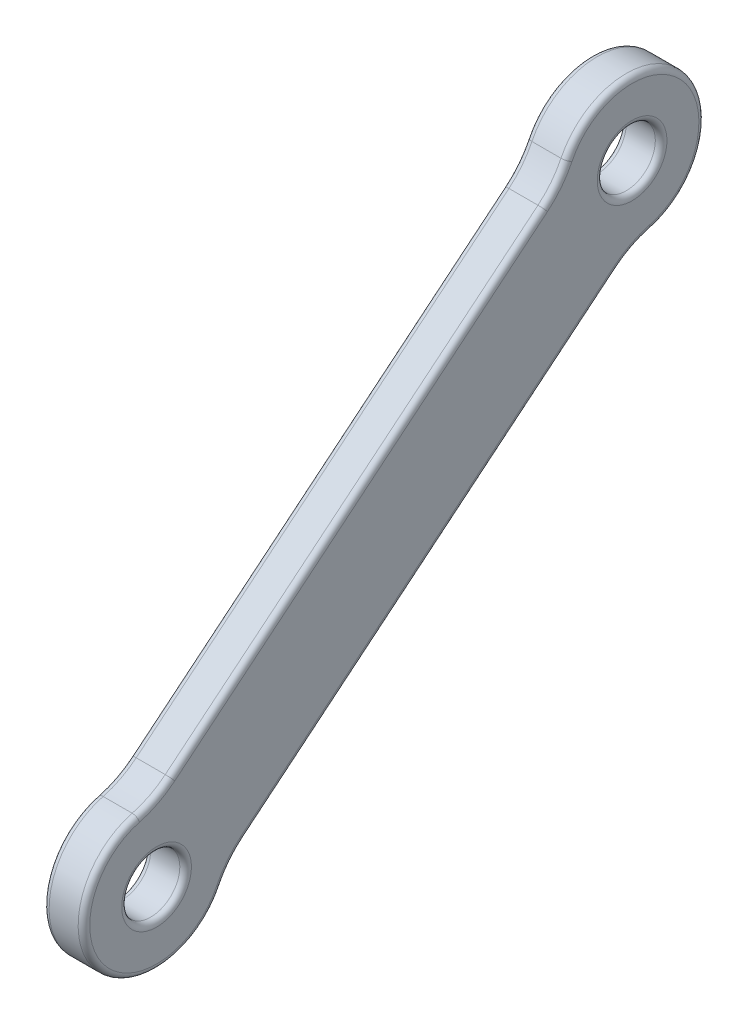
ISO-10303-21;
HEADER;
FILE_DESCRIPTION(('STEP AP214'),'2;1');
FILE_NAME('part.step','',(''),(''),'','','');
FILE_SCHEMA(('AUTOMOTIVE_DESIGN { 1 0 10303 214 1 1 1 1 }'));
ENDSEC;
DATA;
#1=APPLICATION_CONTEXT('core data for automotive mechanical design processes');
#2=APPLICATION_PROTOCOL_DEFINITION('international standard','automotive_design',2000,#1);
#3=PRODUCT_CONTEXT('',#1,'mechanical');
#4=PRODUCT('Part','Part','',(#3));
#5=PRODUCT_RELATED_PRODUCT_CATEGORY('part','',(#4));
#6=PRODUCT_DEFINITION_FORMATION('','',#4);
#7=PRODUCT_DEFINITION_CONTEXT('part definition',#1,'design');
#8=PRODUCT_DEFINITION('design','',#6,#7);
#9=PRODUCT_DEFINITION_SHAPE('','',#8);
#10=(LENGTH_UNIT() NAMED_UNIT(*) SI_UNIT(.MILLI.,.METRE.));
#11=(NAMED_UNIT(*) PLANE_ANGLE_UNIT() SI_UNIT($,.RADIAN.));
#12=(NAMED_UNIT(*) SI_UNIT($,.STERADIAN.) SOLID_ANGLE_UNIT());
#13=UNCERTAINTY_MEASURE_WITH_UNIT(LENGTH_MEASURE(1.E-05),#10,'distance_accuracy_value','');
#14=(GEOMETRIC_REPRESENTATION_CONTEXT(3) GLOBAL_UNCERTAINTY_ASSIGNED_CONTEXT((#13)) GLOBAL_UNIT_ASSIGNED_CONTEXT((#10,
#11,#12)) REPRESENTATION_CONTEXT('',''));
#15=CARTESIAN_POINT('',(0.,0.,0.));
#16=DIRECTION('',(0.,0.,1.));
#17=DIRECTION('',(1.,0.,0.));
#18=AXIS2_PLACEMENT_3D('',#15,#16,#17);
#19=CARTESIAN_POINT('',(7.,79.37572597113,-57.1224912642021));
#20=DIRECTION('',(1.,0.,0.));
#21=DIRECTION('',(0.,0.,-1.));
#22=AXIS2_PLACEMENT_3D('',#19,#20,#21);
#23=PLANE('',#22);
#24=CARTESIAN_POINT('',(7.,67.3497753058128,-81.853575158673));
#25=DIRECTION('',(1.,0.,0.));
#26=DIRECTION('',(0.,0.,-1.));
#27=AXIS2_PLACEMENT_3D('',#24,#25,#26);
#28=CIRCLE('',#27,5.99999999999845);
#29=CARTESIAN_POINT('',(7.,67.3497753058128,-87.8535751586714));
#30=VERTEX_POINT('',#29);
#31=EDGE_CURVE('E11',#30,#30,#28,.F.);
#32=ORIENTED_EDGE('',*,*,#31,.T.);
#33=EDGE_LOOP('',(#32));
#34=FACE_BOUND('',#33,.T.);
#35=CARTESIAN_POINT('',(7.,40.765549009494,-88.8912532009045));
#36=DIRECTION('',(1.,0.,0.));
#37=DIRECTION('',(0.,0.,-1.));
#38=AXIS2_PLACEMENT_3D('',#35,#36,#37);
#39=CIRCLE('',#38,16.);
#40=CARTESIAN_POINT('',(7.,53.120805637218,-78.725249381159));
#41=VERTEX_POINT('',#40);
#42=CARTESIAN_POINT('',(7.,56.2327352182613,-84.7966041581516));
#43=VERTEX_POINT('',#42);
#44=EDGE_CURVE('E58',#41,#43,#39,.F.);
#45=ORIENTED_EDGE('',*,*,#44,.T.);
#46=CARTESIAN_POINT('',(7.,67.3497753058128,-81.853575158673));
#47=DIRECTION('',(1.,0.,0.));
#48=DIRECTION('',(0.,0.,-1.));
#49=AXIS2_PLACEMENT_3D('',#46,#47,#48);
#50=CIRCLE('',#49,11.5);
#51=CARTESIAN_POINT('',(7.,72.3788092204,-71.5114855300761));
#52=VERTEX_POINT('',#51);
#53=EDGE_CURVE('E50',#43,#52,#50,.T.);
#54=ORIENTED_EDGE('',*,*,#53,.T.);
#55=CARTESIAN_POINT('',(7.,79.37572597113,-57.1224912642021));
#56=DIRECTION('',(1.,0.,0.));
#57=DIRECTION('',(0.,0.,-1.));
#58=AXIS2_PLACEMENT_3D('',#55,#56,#57);
#59=CIRCLE('',#58,16.);
#60=CARTESIAN_POINT('',(7.,67.0204693434057,-67.2884950839473));
#61=VERTEX_POINT('',#60);
#62=EDGE_CURVE('E241',#52,#61,#59,.F.);
#63=ORIENTED_EDGE('',*,*,#62,.T.);
#64=DIRECTION('',(0.,-0.635375238734072,0.772203539232773));
#65=VECTOR('',#64,1.);
#66=CARTESIAN_POINT('',(7.,14.2289696685938,-3.12832577751079));
#67=LINE('',#66,#65);
#68=CARTESIAN_POINT('',(7.,14.2289696685938,-3.12832577751081));
#69=VERTEX_POINT('',#68);
#70=EDGE_CURVE('E243',#61,#69,#67,.T.);
#71=ORIENTED_EDGE('',*,*,#70,.T.);
#72=CARTESIAN_POINT('',(7.,26.584226296318,7.03767804223475));
#73=DIRECTION('',(1.,0.,0.));
#74=DIRECTION('',(0.,0.,-1.));
#75=AXIS2_PLACEMENT_3D('',#72,#73,#74);
#76=CIRCLE('',#75,16.0000000000001);
#77=CARTESIAN_POINT('',(7.,11.1170400875511,2.9430289994798));
#78=VERTEX_POINT('',#77);
#79=EDGE_CURVE('E245',#69,#78,#76,.F.);
#80=ORIENTED_EDGE('',*,*,#79,.T.);
#81=CARTESIAN_POINT('',(7.,0.,0.));
#82=DIRECTION('',(1.,0.,0.));
#83=DIRECTION('',(0.,0.,-1.));
#84=AXIS2_PLACEMENT_3D('',#81,#82,#83);
#85=CIRCLE('',#84,11.5);
#86=CARTESIAN_POINT('',(7.,-5.02903391458844,-10.3420896285963));
#87=VERTEX_POINT('',#86);
#88=EDGE_CURVE('E247',#78,#87,#85,.T.);
#89=ORIENTED_EDGE('',*,*,#88,.T.);
#90=CARTESIAN_POINT('',(7.,-12.0259506653202,-24.7310838944694));
#91=DIRECTION('',(1.,0.,0.));
#92=DIRECTION('',(0.,0.,-1.));
#93=AXIS2_PLACEMENT_3D('',#90,#91,#92);
#94=CIRCLE('',#93,16.);
#95=CARTESIAN_POINT('',(7.,0.329305962404,-14.5650800747241));
#96=VERTEX_POINT('',#95);
#97=EDGE_CURVE('E249',#87,#96,#94,.F.);
#98=ORIENTED_EDGE('',*,*,#97,.T.);
#99=DIRECTION('',(0.,0.635375238734096,-0.772203539232753));
#100=VECTOR('',#99,1.);
#101=CARTESIAN_POINT('',(7.,53.120805637218,-78.725249381159));
#102=LINE('',#101,#100);
#103=EDGE_CURVE('E63',#96,#41,#102,.T.);
#104=ORIENTED_EDGE('',*,*,#103,.T.);
#105=EDGE_LOOP('',(#45,#54,#63,#71,#80,#89,#98,#104));
#106=FACE_BOUND('',#105,.T.);
#107=CARTESIAN_POINT('',(7.,0.,0.));
#108=DIRECTION('',(1.,0.,0.));
#109=DIRECTION('',(0.,0.,-1.));
#110=AXIS2_PLACEMENT_3D('',#107,#108,#109);
#111=CIRCLE('',#110,6.);
#112=CARTESIAN_POINT('',(7.,0.,-6.));
#113=VERTEX_POINT('',#112);
#114=EDGE_CURVE('E238',#113,#113,#111,.F.);
#115=ORIENTED_EDGE('',*,*,#114,.T.);
#116=EDGE_LOOP('',(#115));
#117=FACE_BOUND('',#116,.T.);
#118=ADVANCED_FACE('F41',(#34,#106,#117),#23,.T.);
#119=CARTESIAN_POINT('',(0.,79.37572597113,-57.1224912642021));
#120=DIRECTION('',(1.,0.,0.));
#121=DIRECTION('',(0.,0.,-1.));
#122=AXIS2_PLACEMENT_3D('',#119,#120,#121);
#123=PLANE('',#122);
#124=CARTESIAN_POINT('',(0.,67.3497753058128,-81.853575158673));
#125=DIRECTION('',(1.,0.,0.));
#126=DIRECTION('',(0.,0.,-1.));
#127=AXIS2_PLACEMENT_3D('',#124,#125,#126);
#128=CIRCLE('',#127,5.99999999999845);
#129=CARTESIAN_POINT('',(0.,67.3497753058128,-87.8535751586714));
#130=VERTEX_POINT('',#129);
#131=EDGE_CURVE('E186',#130,#130,#128,.T.);
#132=ORIENTED_EDGE('',*,*,#131,.T.);
#133=EDGE_LOOP('',(#132));
#134=FACE_BOUND('',#133,.T.);
#135=CARTESIAN_POINT('',(0.,0.,0.));
#136=DIRECTION('',(1.,0.,0.));
#137=DIRECTION('',(0.,0.,-1.));
#138=AXIS2_PLACEMENT_3D('',#135,#136,#137);
#139=CIRCLE('',#138,6.);
#140=CARTESIAN_POINT('',(0.,0.,-6.));
#141=VERTEX_POINT('',#140);
#142=EDGE_CURVE('E183',#141,#141,#139,.T.);
#143=ORIENTED_EDGE('',*,*,#142,.T.);
#144=EDGE_LOOP('',(#143));
#145=FACE_BOUND('',#144,.T.);
#146=CARTESIAN_POINT('',(0.,26.584226296318,7.03767804223475));
#147=DIRECTION('',(1.,0.,0.));
#148=DIRECTION('',(0.,0.,-1.));
#149=AXIS2_PLACEMENT_3D('',#146,#147,#148);
#150=CIRCLE('',#149,16.0000000000001);
#151=CARTESIAN_POINT('',(0.,11.1170400875512,2.94302899947979));
#152=VERTEX_POINT('',#151);
#153=CARTESIAN_POINT('',(0.,14.2289696685938,-3.12832577751074));
#154=VERTEX_POINT('',#153);
#155=EDGE_CURVE('E182',#152,#154,#150,.T.);
#156=ORIENTED_EDGE('',*,*,#155,.T.);
#157=DIRECTION('',(0.,-0.635375238734072,0.772203539232773));
#158=VECTOR('',#157,1.);
#159=CARTESIAN_POINT('',(0.,67.0204693434057,-67.2884950839473));
#160=LINE('',#159,#158);
#161=CARTESIAN_POINT('',(0.,67.0204693434057,-67.2884950839473));
#162=VERTEX_POINT('',#161);
#163=EDGE_CURVE('E161',#154,#162,#160,.F.);
#164=ORIENTED_EDGE('',*,*,#163,.T.);
#165=CARTESIAN_POINT('',(0.,79.37572597113,-57.1224912642021));
#166=DIRECTION('',(1.,0.,0.));
#167=DIRECTION('',(0.,0.,-1.));
#168=AXIS2_PLACEMENT_3D('',#165,#166,#167);
#169=CIRCLE('',#168,16.);
#170=CARTESIAN_POINT('',(0.,72.3788092204,-71.5114855300761));
#171=VERTEX_POINT('',#170);
#172=EDGE_CURVE('E171',#162,#171,#169,.T.);
#173=ORIENTED_EDGE('',*,*,#172,.T.);
#174=CARTESIAN_POINT('',(0.,67.3497753058128,-81.853575158673));
#175=DIRECTION('',(1.,0.,0.));
#176=DIRECTION('',(0.,0.,-1.));
#177=AXIS2_PLACEMENT_3D('',#174,#175,#176);
#178=CIRCLE('',#177,11.5);
#179=CARTESIAN_POINT('',(0.,56.2327352182613,-84.7966041581516));
#180=VERTEX_POINT('',#179);
#181=EDGE_CURVE('E177',#171,#180,#178,.F.);
#182=ORIENTED_EDGE('',*,*,#181,.T.);
#183=CARTESIAN_POINT('',(0.,40.765549009494,-88.8912532009045));
#184=DIRECTION('',(1.,0.,0.));
#185=DIRECTION('',(0.,0.,-1.));
#186=AXIS2_PLACEMENT_3D('',#183,#184,#185);
#187=CIRCLE('',#186,16.);
#188=CARTESIAN_POINT('',(0.,53.120805637218,-78.725249381159));
#189=VERTEX_POINT('',#188);
#190=EDGE_CURVE('E327',#180,#189,#187,.T.);
#191=ORIENTED_EDGE('',*,*,#190,.T.);
#192=DIRECTION('',(0.,0.635375238734096,-0.772203539232753));
#193=VECTOR('',#192,1.);
#194=CARTESIAN_POINT('',(0.,53.1208056372185,-78.7252493811597));
#195=LINE('',#194,#193);
#196=CARTESIAN_POINT('',(0.,0.329305962403997,-14.5650800747241));
#197=VERTEX_POINT('',#196);
#198=EDGE_CURVE('E329',#189,#197,#195,.F.);
#199=ORIENTED_EDGE('',*,*,#198,.T.);
#200=CARTESIAN_POINT('',(0.,-12.0259506653202,-24.7310838944694));
#201=DIRECTION('',(1.,0.,0.));
#202=DIRECTION('',(0.,0.,-1.));
#203=AXIS2_PLACEMENT_3D('',#200,#201,#202);
#204=CIRCLE('',#203,16.);
#205=CARTESIAN_POINT('',(0.,-5.02903391458845,-10.3420896285963));
#206=VERTEX_POINT('',#205);
#207=EDGE_CURVE('E331',#197,#206,#204,.T.);
#208=ORIENTED_EDGE('',*,*,#207,.T.);
#209=CARTESIAN_POINT('',(0.,0.,0.));
#210=DIRECTION('',(1.,0.,0.));
#211=DIRECTION('',(0.,0.,-1.));
#212=AXIS2_PLACEMENT_3D('',#209,#210,#211);
#213=CIRCLE('',#212,11.5);
#214=EDGE_CURVE('E188',#206,#152,#213,.F.);
#215=ORIENTED_EDGE('',*,*,#214,.T.);
#216=EDGE_LOOP('',(#156,#164,#173,#182,#191,#199,#208,#215));
#217=FACE_BOUND('',#216,.T.);
#218=ADVANCED_FACE('F180',(#134,#145,#217),#123,.F.);
#219=CARTESIAN_POINT('',(7.,79.37572597113,-57.1224912642021));
#220=DIRECTION('',(-1.,0.,0.));
#221=DIRECTION('',(0.,0.,1.));
#222=AXIS2_PLACEMENT_3D('',#219,#220,#221);
#223=CYLINDRICAL_SURFACE('',#222,15.);
#224=DIRECTION('',(-1.,0.,0.));
#225=VECTOR('',#224,1.);
#226=CARTESIAN_POINT('',(7.,72.8161165173207,-70.612173388459));
#227=LINE('',#226,#225);
#228=CARTESIAN_POINT('',(6.,72.8161165173207,-70.612173388459));
#229=VERTEX_POINT('',#228);
#230=CARTESIAN_POINT('',(1.,72.8161165173207,-70.612173388459));
#231=VERTEX_POINT('',#230);
#232=EDGE_CURVE('E270',#229,#231,#227,.T.);
#233=ORIENTED_EDGE('',*,*,#232,.T.);
#234=CARTESIAN_POINT('',(1.,79.37572597113,-57.1224912642021));
#235=DIRECTION('',(1.,0.,0.));
#236=DIRECTION('',(0.,0.,-1.));
#237=AXIS2_PLACEMENT_3D('',#234,#235,#236);
#238=CIRCLE('',#237,15.);
#239=CARTESIAN_POINT('',(1.,67.7926728826384,-66.6531198452132));
#240=VERTEX_POINT('',#239);
#241=EDGE_CURVE('E236',#231,#240,#238,.F.);
#242=ORIENTED_EDGE('',*,*,#241,.T.);
#243=DIRECTION('',(-1.,0.,0.));
#244=VECTOR('',#243,1.);
#245=CARTESIAN_POINT('',(7.,67.7926728826384,-66.6531198452132));
#246=LINE('',#245,#244);
#247=CARTESIAN_POINT('',(6.,67.7926728826384,-66.6531198452132));
#248=VERTEX_POINT('',#247);
#249=EDGE_CURVE('E178',#248,#240,#246,.T.);
#250=ORIENTED_EDGE('',*,*,#249,.F.);
#251=CARTESIAN_POINT('',(6.,79.37572597113,-57.1224912642021));
#252=DIRECTION('',(1.,0.,0.));
#253=DIRECTION('',(0.,0.,-1.));
#254=AXIS2_PLACEMENT_3D('',#251,#252,#253);
#255=CIRCLE('',#254,15.);
#256=EDGE_CURVE('E234',#248,#229,#255,.T.);
#257=ORIENTED_EDGE('',*,*,#256,.T.);
#258=EDGE_LOOP('',(#233,#242,#250,#257));
#259=FACE_BOUND('',#258,.T.);
#260=ADVANCED_FACE('F348',(#259),#223,.F.);
#261=CARTESIAN_POINT('',(7.,67.7926728826384,-66.6531198452132));
#262=DIRECTION('',(0.,-0.772203539232773,-0.635375238734072));
#263=DIRECTION('',(0.,0.635375238734072,-0.772203539232773));
#264=AXIS2_PLACEMENT_3D('',#261,#262,#263);
#265=PLANE('',#264);
#266=ORIENTED_EDGE('',*,*,#249,.T.);
#267=DIRECTION('',(0.,-0.635375238734072,0.772203539232773));
#268=VECTOR('',#267,1.);
#269=CARTESIAN_POINT('',(1.,67.7926728826384,-66.6531198452132));
#270=LINE('',#269,#268);
#271=CARTESIAN_POINT('',(1.,15.0011732078266,-2.49295053877667));
#272=VERTEX_POINT('',#271);
#273=EDGE_CURVE('E164',#240,#272,#270,.T.);
#274=ORIENTED_EDGE('',*,*,#273,.T.);
#275=DIRECTION('',(-1.,0.,0.));
#276=VECTOR('',#275,1.);
#277=CARTESIAN_POINT('',(7.,15.0011732078266,-2.49295053877667));
#278=LINE('',#277,#276);
#279=CARTESIAN_POINT('',(6.,15.0011732078266,-2.49295053877667));
#280=VERTEX_POINT('',#279);
#281=EDGE_CURVE('E317',#280,#272,#278,.T.);
#282=ORIENTED_EDGE('',*,*,#281,.F.);
#283=DIRECTION('',(0.,-0.635375238734072,0.772203539232773));
#284=VECTOR('',#283,1.);
#285=CARTESIAN_POINT('',(6.,67.7926728826384,-66.6531198452132));
#286=LINE('',#285,#284);
#287=EDGE_CURVE('E206',#280,#248,#286,.F.);
#288=ORIENTED_EDGE('',*,*,#287,.T.);
#289=EDGE_LOOP('',(#266,#274,#282,#288));
#290=FACE_BOUND('',#289,.T.);
#291=ADVANCED_FACE('F341',(#290),#265,.F.);
#292=CARTESIAN_POINT('',(7.,26.584226296318,7.03767804223475));
#293=DIRECTION('',(-1.,0.,0.));
#294=DIRECTION('',(0.,0.,1.));
#295=AXIS2_PLACEMENT_3D('',#292,#293,#294);
#296=CYLINDRICAL_SURFACE('',#295,15.0000000000001);
#297=ORIENTED_EDGE('',*,*,#281,.T.);
#298=CARTESIAN_POINT('',(1.,26.584226296318,7.03767804223475));
#299=DIRECTION('',(1.,0.,0.));
#300=DIRECTION('',(0.,0.,-1.));
#301=AXIS2_PLACEMENT_3D('',#298,#299,#300);
#302=CIRCLE('',#301,15.0000000000001);
#303=CARTESIAN_POINT('',(1.,12.0837392255991,3.19894456465198));
#304=VERTEX_POINT('',#303);
#305=EDGE_CURVE('E211',#272,#304,#302,.F.);
#306=ORIENTED_EDGE('',*,*,#305,.T.);
#307=DIRECTION('',(-1.,0.,0.));
#308=VECTOR('',#307,1.);
#309=CARTESIAN_POINT('',(7.,12.0837392255991,3.19894456465198));
#310=LINE('',#309,#308);
#311=CARTESIAN_POINT('',(6.,12.0837392255991,3.19894456465198));
#312=VERTEX_POINT('',#311);
#313=EDGE_CURVE('E308',#312,#304,#310,.T.);
#314=ORIENTED_EDGE('',*,*,#313,.F.);
#315=CARTESIAN_POINT('',(6.,26.584226296318,7.03767804223475));
#316=DIRECTION('',(1.,0.,0.));
#317=DIRECTION('',(0.,0.,-1.));
#318=AXIS2_PLACEMENT_3D('',#315,#316,#317);
#319=CIRCLE('',#318,15.0000000000001);
#320=EDGE_CURVE('E209',#312,#280,#319,.T.);
#321=ORIENTED_EDGE('',*,*,#320,.T.);
#322=EDGE_LOOP('',(#297,#306,#314,#321));
#323=FACE_BOUND('',#322,.T.);
#324=ADVANCED_FACE('F314',(#323),#296,.F.);
#325=CARTESIAN_POINT('',(7.,0.,0.));
#326=DIRECTION('',(-1.,0.,0.));
#327=DIRECTION('',(0.,0.,1.));
#328=AXIS2_PLACEMENT_3D('',#325,#326,#327);
#329=CYLINDRICAL_SURFACE('',#328,12.5);
#330=ORIENTED_EDGE('',*,*,#313,.T.);
#331=CARTESIAN_POINT('',(1.,0.,0.));
#332=DIRECTION('',(1.,0.,0.));
#333=DIRECTION('',(0.,0.,-1.));
#334=AXIS2_PLACEMENT_3D('',#331,#332,#333);
#335=CIRCLE('',#334,12.5);
#336=CARTESIAN_POINT('',(1.,-5.46634121150919,-11.2414017702134));
#337=VERTEX_POINT('',#336);
#338=EDGE_CURVE('E215',#304,#337,#335,.T.);
#339=ORIENTED_EDGE('',*,*,#338,.T.);
#340=DIRECTION('',(-1.,0.,0.));
#341=VECTOR('',#340,1.);
#342=CARTESIAN_POINT('',(7.,-5.46634121150919,-11.2414017702134));
#343=LINE('',#342,#341);
#344=CARTESIAN_POINT('',(6.,-5.46634121150919,-11.2414017702134));
#345=VERTEX_POINT('',#344);
#346=EDGE_CURVE('E311',#345,#337,#343,.T.);
#347=ORIENTED_EDGE('',*,*,#346,.F.);
#348=CARTESIAN_POINT('',(6.,0.,0.));
#349=DIRECTION('',(1.,0.,0.));
#350=DIRECTION('',(0.,0.,-1.));
#351=AXIS2_PLACEMENT_3D('',#348,#349,#350);
#352=CIRCLE('',#351,12.5);
#353=EDGE_CURVE('E213',#345,#312,#352,.F.);
#354=ORIENTED_EDGE('',*,*,#353,.T.);
#355=EDGE_LOOP('',(#330,#339,#347,#354));
#356=FACE_BOUND('',#355,.T.);
#357=ADVANCED_FACE('F307',(#356),#329,.T.);
#358=CARTESIAN_POINT('',(7.,-12.0259506653202,-24.7310838944694));
#359=DIRECTION('',(-1.,0.,0.));
#360=DIRECTION('',(0.,0.,1.));
#361=AXIS2_PLACEMENT_3D('',#358,#359,#360);
#362=CYLINDRICAL_SURFACE('',#361,15.);
#363=ORIENTED_EDGE('',*,*,#346,.T.);
#364=CARTESIAN_POINT('',(1.,-12.0259506653202,-24.7310838944694));
#365=DIRECTION('',(1.,0.,0.));
#366=DIRECTION('',(0.,0.,-1.));
#367=AXIS2_PLACEMENT_3D('',#364,#365,#366);
#368=CIRCLE('',#367,15.);
#369=CARTESIAN_POINT('',(1.,-0.442897576828766,-15.2004553134582));
#370=VERTEX_POINT('',#369);
#371=EDGE_CURVE('E219',#337,#370,#368,.F.);
#372=ORIENTED_EDGE('',*,*,#371,.T.);
#373=DIRECTION('',(-1.,0.,0.));
#374=VECTOR('',#373,1.);
#375=CARTESIAN_POINT('',(7.,-0.442897576828766,-15.2004553134582));
#376=LINE('',#375,#374);
#377=CARTESIAN_POINT('',(6.,-0.442897576828766,-15.2004553134582));
#378=VERTEX_POINT('',#377);
#379=EDGE_CURVE('E320',#378,#370,#376,.T.);
#380=ORIENTED_EDGE('',*,*,#379,.F.);
#381=CARTESIAN_POINT('',(6.,-12.0259506653202,-24.7310838944694));
#382=DIRECTION('',(1.,0.,0.));
#383=DIRECTION('',(0.,0.,-1.));
#384=AXIS2_PLACEMENT_3D('',#381,#382,#383);
#385=CIRCLE('',#384,15.);
#386=EDGE_CURVE('E217',#378,#345,#385,.T.);
#387=ORIENTED_EDGE('',*,*,#386,.T.);
#388=EDGE_LOOP('',(#363,#372,#380,#387));
#389=FACE_BOUND('',#388,.T.);
#390=ADVANCED_FACE('F393',(#389),#362,.F.);
#391=CARTESIAN_POINT('',(7.,-0.442897576828766,-15.2004553134582));
#392=DIRECTION('',(0.,0.772203539232753,0.635375238734096));
#393=DIRECTION('',(0.,-0.635375238734096,0.772203539232753));
#394=AXIS2_PLACEMENT_3D('',#391,#392,#393);
#395=PLANE('',#394);
#396=ORIENTED_EDGE('',*,*,#379,.T.);
#397=DIRECTION('',(0.,0.635375238734096,-0.772203539232753));
#398=VECTOR('',#397,1.);
#399=CARTESIAN_POINT('',(1.,-0.442897576828766,-15.2004553134582));
#400=LINE('',#399,#398);
#401=CARTESIAN_POINT('',(1.,52.3486020979853,-79.3606246198931));
#402=VERTEX_POINT('',#401);
#403=EDGE_CURVE('E223',#370,#402,#400,.T.);
#404=ORIENTED_EDGE('',*,*,#403,.T.);
#405=DIRECTION('',(-1.,0.,0.));
#406=VECTOR('',#405,1.);
#407=CARTESIAN_POINT('',(7.,52.3486020979853,-79.3606246198931));
#408=LINE('',#407,#406);
#409=CARTESIAN_POINT('',(6.,52.3486020979853,-79.3606246198931));
#410=VERTEX_POINT('',#409);
#411=EDGE_CURVE('E374',#410,#402,#408,.T.);
#412=ORIENTED_EDGE('',*,*,#411,.F.);
#413=DIRECTION('',(0.,0.635375238734096,-0.772203539232753));
#414=VECTOR('',#413,1.);
#415=CARTESIAN_POINT('',(6.,-0.442897576828782,-15.2004553134582));
#416=LINE('',#415,#414);
#417=EDGE_CURVE('E221',#410,#378,#416,.F.);
#418=ORIENTED_EDGE('',*,*,#417,.T.);
#419=EDGE_LOOP('',(#396,#404,#412,#418));
#420=FACE_BOUND('',#419,.T.);
#421=ADVANCED_FACE('F382',(#420),#395,.F.);
#422=CARTESIAN_POINT('',(7.,40.765549009494,-88.8912532009045));
#423=DIRECTION('',(-1.,0.,0.));
#424=DIRECTION('',(0.,0.,1.));
#425=AXIS2_PLACEMENT_3D('',#422,#423,#424);
#426=CYLINDRICAL_SURFACE('',#425,15.);
#427=ORIENTED_EDGE('',*,*,#411,.T.);
#428=CARTESIAN_POINT('',(1.,40.765549009494,-88.8912532009045));
#429=DIRECTION('',(1.,0.,0.));
#430=DIRECTION('',(0.,0.,-1.));
#431=AXIS2_PLACEMENT_3D('',#428,#429,#430);
#432=CIRCLE('',#431,15.);
#433=CARTESIAN_POINT('',(1.,55.2660360802133,-85.0525197233237));
#434=VERTEX_POINT('',#433);
#435=EDGE_CURVE('E227',#402,#434,#432,.F.);
#436=ORIENTED_EDGE('',*,*,#435,.T.);
#437=DIRECTION('',(-1.,0.,0.));
#438=VECTOR('',#437,1.);
#439=CARTESIAN_POINT('',(7.,55.2660360802133,-85.0525197233237));
#440=LINE('',#439,#438);
#441=CARTESIAN_POINT('',(6.,55.2660360802133,-85.0525197233237));
#442=VERTEX_POINT('',#441);
#443=EDGE_CURVE('E367',#442,#434,#440,.T.);
#444=ORIENTED_EDGE('',*,*,#443,.F.);
#445=CARTESIAN_POINT('',(6.,40.765549009494,-88.8912532009045));
#446=DIRECTION('',(1.,0.,0.));
#447=DIRECTION('',(0.,0.,-1.));
#448=AXIS2_PLACEMENT_3D('',#445,#446,#447);
#449=CIRCLE('',#448,15.);
#450=EDGE_CURVE('E225',#442,#410,#449,.T.);
#451=ORIENTED_EDGE('',*,*,#450,.T.);
#452=EDGE_LOOP('',(#427,#436,#444,#451));
#453=FACE_BOUND('',#452,.T.);
#454=ADVANCED_FACE('F371',(#453),#426,.F.);
#455=CARTESIAN_POINT('',(7.,67.3497753058128,-81.853575158673));
#456=DIRECTION('',(-1.,0.,0.));
#457=DIRECTION('',(0.,0.,1.));
#458=AXIS2_PLACEMENT_3D('',#455,#456,#457);
#459=CYLINDRICAL_SURFACE('',#458,12.5);
#460=ORIENTED_EDGE('',*,*,#443,.T.);
#461=CARTESIAN_POINT('',(1.,67.3497753058128,-81.853575158673));
#462=DIRECTION('',(1.,0.,0.));
#463=DIRECTION('',(0.,0.,-1.));
#464=AXIS2_PLACEMENT_3D('',#461,#462,#463);
#465=CIRCLE('',#464,12.5);
#466=EDGE_CURVE('E232',#434,#231,#465,.T.);
#467=ORIENTED_EDGE('',*,*,#466,.T.);
#468=ORIENTED_EDGE('',*,*,#232,.F.);
#469=CARTESIAN_POINT('',(6.,67.3497753058128,-81.853575158673));
#470=DIRECTION('',(1.,0.,0.));
#471=DIRECTION('',(0.,0.,-1.));
#472=AXIS2_PLACEMENT_3D('',#469,#470,#471);
#473=CIRCLE('',#472,12.5);
#474=EDGE_CURVE('E229',#229,#442,#473,.F.);
#475=ORIENTED_EDGE('',*,*,#474,.T.);
#476=EDGE_LOOP('',(#460,#467,#468,#475));
#477=FACE_BOUND('',#476,.T.);
#478=ADVANCED_FACE('F366',(#477),#459,.T.);
#479=CARTESIAN_POINT('',(7.,0.,0.));
#480=DIRECTION('',(-1.,0.,0.));
#481=DIRECTION('',(0.,0.,1.));
#482=AXIS2_PLACEMENT_3D('',#479,#480,#481);
#483=CYLINDRICAL_SURFACE('',#482,5.);
#484=CARTESIAN_POINT('',(1.,0.,0.));
#485=DIRECTION('',(1.,0.,0.));
#486=DIRECTION('',(0.,0.,-1.));
#487=AXIS2_PLACEMENT_3D('',#484,#485,#486);
#488=CIRCLE('',#487,5.);
#489=CARTESIAN_POINT('',(1.,0.,-5.));
#490=VERTEX_POINT('',#489);
#491=EDGE_CURVE('E203',#490,#490,#488,.F.);
#492=ORIENTED_EDGE('',*,*,#491,.T.);
#493=EDGE_LOOP('',(#492));
#494=FACE_BOUND('',#493,.T.);
#495=CARTESIAN_POINT('',(6.,0.,0.));
#496=DIRECTION('',(1.,0.,0.));
#497=DIRECTION('',(0.,0.,-1.));
#498=AXIS2_PLACEMENT_3D('',#495,#496,#497);
#499=CIRCLE('',#498,5.);
#500=CARTESIAN_POINT('',(6.,0.,-5.));
#501=VERTEX_POINT('',#500);
#502=EDGE_CURVE('E200',#501,#501,#499,.T.);
#503=ORIENTED_EDGE('',*,*,#502,.T.);
#504=EDGE_LOOP('',(#503));
#505=FACE_BOUND('',#504,.T.);
#506=ADVANCED_FACE('F411',(#494,#505),#483,.F.);
#507=CARTESIAN_POINT('',(7.,67.3497753058128,-81.853575158673));
#508=DIRECTION('',(-1.,0.,0.));
#509=DIRECTION('',(0.,0.,1.));
#510=AXIS2_PLACEMENT_3D('',#507,#508,#509);
#511=CYLINDRICAL_SURFACE('',#510,4.99999999999845);
#512=CARTESIAN_POINT('',(1.,67.3497753058128,-81.853575158673));
#513=DIRECTION('',(1.,0.,0.));
#514=DIRECTION('',(0.,0.,-1.));
#515=AXIS2_PLACEMENT_3D('',#512,#513,#514);
#516=CIRCLE('',#515,4.99999999999845);
#517=CARTESIAN_POINT('',(1.,67.3497753058128,-86.8535751586714));
#518=VERTEX_POINT('',#517);
#519=EDGE_CURVE('E197',#518,#518,#516,.F.);
#520=ORIENTED_EDGE('',*,*,#519,.T.);
#521=EDGE_LOOP('',(#520));
#522=FACE_BOUND('',#521,.T.);
#523=CARTESIAN_POINT('',(6.,67.3497753058128,-81.853575158673));
#524=DIRECTION('',(1.,0.,0.));
#525=DIRECTION('',(0.,0.,-1.));
#526=AXIS2_PLACEMENT_3D('',#523,#524,#525);
#527=CIRCLE('',#526,4.99999999999845);
#528=CARTESIAN_POINT('',(6.,67.3497753058128,-86.8535751586714));
#529=VERTEX_POINT('',#528);
#530=EDGE_CURVE('E194',#529,#529,#527,.T.);
#531=ORIENTED_EDGE('',*,*,#530,.T.);
#532=EDGE_LOOP('',(#531));
#533=FACE_BOUND('',#532,.T.);
#534=ADVANCED_FACE('F433',(#522,#533),#511,.F.);
#535=CARTESIAN_POINT('',(1.,67.3497753058128,-81.853575158673));
#536=DIRECTION('',(1.,0.,0.));
#537=DIRECTION('',(0.,0.,-1.));
#538=AXIS2_PLACEMENT_3D('',#535,#536,#537);
#539=TOROIDAL_SURFACE('',#538,5.99999999999845,1.);
#540=ORIENTED_EDGE('',*,*,#519,.F.);
#541=EDGE_LOOP('',(#540));
#542=FACE_BOUND('',#541,.T.);
#543=ORIENTED_EDGE('',*,*,#131,.F.);
#544=EDGE_LOOP('',(#543));
#545=FACE_BOUND('',#544,.T.);
#546=ADVANCED_FACE('F441',(#542,#545),#539,.T.);
#547=CARTESIAN_POINT('',(1.,0.,0.));
#548=DIRECTION('',(1.,0.,0.));
#549=DIRECTION('',(0.,0.,-1.));
#550=AXIS2_PLACEMENT_3D('',#547,#548,#549);
#551=TOROIDAL_SURFACE('',#550,6.,1.);
#552=ORIENTED_EDGE('',*,*,#491,.F.);
#553=EDGE_LOOP('',(#552));
#554=FACE_BOUND('',#553,.T.);
#555=ORIENTED_EDGE('',*,*,#142,.F.);
#556=EDGE_LOOP('',(#555));
#557=FACE_BOUND('',#556,.T.);
#558=ADVANCED_FACE('F449',(#554,#557),#551,.T.);
#559=CARTESIAN_POINT('',(1.,0.329305962403987,-14.5650800747241));
#560=DIRECTION('',(0.,0.635375238734096,-0.772203539232753));
#561=DIRECTION('',(0.,0.772203539232753,0.635375238734096));
#562=AXIS2_PLACEMENT_3D('',#559,#560,#561);
#563=CYLINDRICAL_SURFACE('',#562,1.);
#564=CARTESIAN_POINT('',(1.,0.329305962403997,-14.5650800747241));
#565=DIRECTION('',(0.,-0.635375238734084,0.772203539232764));
#566=DIRECTION('',(0.,-0.772203539232764,-0.635375238734084));
#567=AXIS2_PLACEMENT_3D('',#564,#565,#566);
#568=CIRCLE('',#567,1.);
#569=EDGE_CURVE('E264',#197,#370,#568,.T.);
#570=ORIENTED_EDGE('',*,*,#569,.F.);
#571=ORIENTED_EDGE('',*,*,#198,.F.);
#572=CARTESIAN_POINT('',(1.,53.120805637218,-78.725249381159));
#573=DIRECTION('',(0.,0.635375238734095,-0.772203539232754));
#574=DIRECTION('',(0.,0.772203539232754,0.635375238734095));
#575=AXIS2_PLACEMENT_3D('',#572,#573,#574);
#576=CIRCLE('',#575,1.);
#577=EDGE_CURVE('E267',#402,#189,#576,.T.);
#578=ORIENTED_EDGE('',*,*,#577,.F.);
#579=ORIENTED_EDGE('',*,*,#403,.F.);
#580=EDGE_LOOP('',(#570,#571,#578,#579));
#581=FACE_BOUND('',#580,.T.);
#582=ADVANCED_FACE('F388',(#581),#563,.T.);
#583=CARTESIAN_POINT('',(1.,40.765549009494,-88.8912532009045));
#584=DIRECTION('',(1.,0.,0.));
#585=DIRECTION('',(0.,0.,-1.));
#586=AXIS2_PLACEMENT_3D('',#583,#584,#585);
#587=TOROIDAL_SURFACE('',#586,16.,1.);
#588=ORIENTED_EDGE('',*,*,#577,.T.);
#589=ORIENTED_EDGE('',*,*,#190,.F.);
#590=CARTESIAN_POINT('',(1.,56.2327352182613,-84.7966041581516));
#591=DIRECTION('',(0.,0.255915565172058,-0.966699138047959));
#592=DIRECTION('',(0.,0.966699138047959,0.255915565172058));
#593=AXIS2_PLACEMENT_3D('',#590,#591,#592);
#594=CIRCLE('',#593,1.);
#595=EDGE_CURVE('E261',#434,#180,#594,.T.);
#596=ORIENTED_EDGE('',*,*,#595,.F.);
#597=ORIENTED_EDGE('',*,*,#435,.F.);
#598=EDGE_LOOP('',(#588,#589,#596,#597));
#599=FACE_BOUND('',#598,.T.);
#600=ADVANCED_FACE('F466',(#599),#587,.T.);
#601=CARTESIAN_POINT('',(1.,-12.0259506653202,-24.7310838944694));
#602=DIRECTION('',(1.,0.,0.));
#603=DIRECTION('',(0.,0.,-1.));
#604=AXIS2_PLACEMENT_3D('',#601,#602,#603);
#605=TOROIDAL_SURFACE('',#604,16.,1.);
#606=ORIENTED_EDGE('',*,*,#569,.T.);
#607=ORIENTED_EDGE('',*,*,#371,.F.);
#608=CARTESIAN_POINT('',(1.,-5.02903391458845,-10.3420896285963));
#609=DIRECTION('',(0.,-0.89931214161707,0.437307296920734));
#610=DIRECTION('',(0.,-0.437307296920734,-0.89931214161707));
#611=AXIS2_PLACEMENT_3D('',#608,#609,#610);
#612=CIRCLE('',#611,1.);
#613=EDGE_CURVE('E258',#206,#337,#612,.T.);
#614=ORIENTED_EDGE('',*,*,#613,.F.);
#615=ORIENTED_EDGE('',*,*,#207,.F.);
#616=EDGE_LOOP('',(#606,#607,#614,#615));
#617=FACE_BOUND('',#616,.T.);
#618=ADVANCED_FACE('F392',(#617),#605,.T.);
#619=CARTESIAN_POINT('',(1.,67.3497753058128,-81.853575158673));
#620=DIRECTION('',(1.,0.,0.));
#621=DIRECTION('',(0.,0.,-1.));
#622=AXIS2_PLACEMENT_3D('',#619,#620,#621);
#623=TOROIDAL_SURFACE('',#622,11.5,1.);
#624=ORIENTED_EDGE('',*,*,#595,.T.);
#625=ORIENTED_EDGE('',*,*,#181,.F.);
#626=CARTESIAN_POINT('',(1.,72.3788092204,-71.5114855300761));
#627=DIRECTION('',(0.,-0.899312141617122,0.437307296920626));
#628=DIRECTION('',(0.,-0.437307296920626,-0.899312141617122));
#629=AXIS2_PLACEMENT_3D('',#626,#627,#628);
#630=CIRCLE('',#629,1.);
#631=EDGE_CURVE('E174',#231,#171,#630,.T.);
#632=ORIENTED_EDGE('',*,*,#631,.F.);
#633=ORIENTED_EDGE('',*,*,#466,.F.);
#634=EDGE_LOOP('',(#624,#625,#632,#633));
#635=FACE_BOUND('',#634,.T.);
#636=ADVANCED_FACE('F482',(#635),#623,.T.);
#637=CARTESIAN_POINT('',(1.,0.,0.));
#638=DIRECTION('',(1.,0.,0.));
#639=DIRECTION('',(0.,0.,-1.));
#640=AXIS2_PLACEMENT_3D('',#637,#638,#639);
#641=TOROIDAL_SURFACE('',#640,11.5,1.);
#642=ORIENTED_EDGE('',*,*,#613,.T.);
#643=ORIENTED_EDGE('',*,*,#338,.F.);
#644=CARTESIAN_POINT('',(1.,11.1170400875512,2.94302899947979));
#645=DIRECTION('',(0.,0.255915565172185,-0.966699138047925));
#646=DIRECTION('',(0.,0.966699138047925,0.255915565172185));
#647=AXIS2_PLACEMENT_3D('',#644,#645,#646);
#648=CIRCLE('',#647,1.);
#649=EDGE_CURVE('E167',#152,#304,#648,.T.);
#650=ORIENTED_EDGE('',*,*,#649,.F.);
#651=ORIENTED_EDGE('',*,*,#214,.F.);
#652=EDGE_LOOP('',(#642,#643,#650,#651));
#653=FACE_BOUND('',#652,.T.);
#654=ADVANCED_FACE('F337',(#653),#641,.T.);
#655=CARTESIAN_POINT('',(1.,79.37572597113,-57.1224912642021));
#656=DIRECTION('',(1.,0.,0.));
#657=DIRECTION('',(0.,0.,-1.));
#658=AXIS2_PLACEMENT_3D('',#655,#656,#657);
#659=TOROIDAL_SURFACE('',#658,16.,1.);
#660=ORIENTED_EDGE('',*,*,#631,.T.);
#661=ORIENTED_EDGE('',*,*,#172,.F.);
#662=CARTESIAN_POINT('',(1.,67.0204693434057,-67.2884950839473));
#663=DIRECTION('',(0.,-0.635375238734072,0.772203539232773));
#664=DIRECTION('',(0.,-0.772203539232773,-0.635375238734072));
#665=AXIS2_PLACEMENT_3D('',#662,#663,#664);
#666=CIRCLE('',#665,1.);
#667=EDGE_CURVE('E157',#240,#162,#666,.T.);
#668=ORIENTED_EDGE('',*,*,#667,.F.);
#669=ORIENTED_EDGE('',*,*,#241,.F.);
#670=EDGE_LOOP('',(#660,#661,#668,#669));
#671=FACE_BOUND('',#670,.T.);
#672=ADVANCED_FACE('F172',(#671),#659,.T.);
#673=CARTESIAN_POINT('',(1.,26.584226296318,7.03767804223475));
#674=DIRECTION('',(1.,0.,0.));
#675=DIRECTION('',(0.,0.,-1.));
#676=AXIS2_PLACEMENT_3D('',#673,#674,#675);
#677=TOROIDAL_SURFACE('',#676,16.0000000000001,1.);
#678=ORIENTED_EDGE('',*,*,#649,.T.);
#679=ORIENTED_EDGE('',*,*,#305,.F.);
#680=CARTESIAN_POINT('',(1.,14.2289696685938,-3.12832577751074));
#681=DIRECTION('',(0.,0.635375238734072,-0.772203539232773));
#682=DIRECTION('',(0.,0.772203539232773,0.635375238734072));
#683=AXIS2_PLACEMENT_3D('',#680,#681,#682);
#684=CIRCLE('',#683,1.);
#685=EDGE_CURVE('E168',#154,#272,#684,.T.);
#686=ORIENTED_EDGE('',*,*,#685,.F.);
#687=ORIENTED_EDGE('',*,*,#155,.F.);
#688=EDGE_LOOP('',(#678,#679,#686,#687));
#689=FACE_BOUND('',#688,.T.);
#690=ADVANCED_FACE('F339',(#689),#677,.T.);
#691=CARTESIAN_POINT('',(1.,67.0204693434057,-67.2884950839473));
#692=DIRECTION('',(0.,-0.635375238734072,0.772203539232773));
#693=DIRECTION('',(0.,-0.772203539232773,-0.635375238734072));
#694=AXIS2_PLACEMENT_3D('',#691,#692,#693);
#695=CYLINDRICAL_SURFACE('',#694,1.);
#696=ORIENTED_EDGE('',*,*,#667,.T.);
#697=ORIENTED_EDGE('',*,*,#163,.F.);
#698=ORIENTED_EDGE('',*,*,#685,.T.);
#699=ORIENTED_EDGE('',*,*,#273,.F.);
#700=EDGE_LOOP('',(#696,#697,#698,#699));
#701=FACE_BOUND('',#700,.T.);
#702=ADVANCED_FACE('F159',(#701),#695,.T.);
#703=CARTESIAN_POINT('',(6.,67.3497753058128,-81.853575158673));
#704=DIRECTION('',(1.,0.,0.));
#705=DIRECTION('',(0.,0.,-1.));
#706=AXIS2_PLACEMENT_3D('',#703,#704,#705);
#707=TOROIDAL_SURFACE('',#706,5.99999999999845,1.);
#708=ORIENTED_EDGE('',*,*,#31,.F.);
#709=EDGE_LOOP('',(#708));
#710=FACE_BOUND('',#709,.T.);
#711=ORIENTED_EDGE('',*,*,#530,.F.);
#712=EDGE_LOOP('',(#711));
#713=FACE_BOUND('',#712,.T.);
#714=ADVANCED_FACE('F519',(#710,#713),#707,.T.);
#715=CARTESIAN_POINT('',(6.,0.,0.));
#716=DIRECTION('',(1.,0.,0.));
#717=DIRECTION('',(0.,0.,-1.));
#718=AXIS2_PLACEMENT_3D('',#715,#716,#717);
#719=TOROIDAL_SURFACE('',#718,11.5,1.);
#720=CARTESIAN_POINT('',(6.,11.1170400875512,2.94302899947982));
#721=DIRECTION('',(0.,0.255915565172158,-0.966699138047932));
#722=DIRECTION('',(0.,0.966699138047932,0.255915565172158));
#723=AXIS2_PLACEMENT_3D('',#720,#721,#722);
#724=CIRCLE('',#723,1.);
#725=EDGE_CURVE('E286',#312,#78,#724,.T.);
#726=ORIENTED_EDGE('',*,*,#725,.F.);
#727=ORIENTED_EDGE('',*,*,#353,.F.);
#728=CARTESIAN_POINT('',(6.,-5.02903391458844,-10.3420896285963));
#729=DIRECTION('',(0.,0.89931214161707,-0.437307296920734));
#730=DIRECTION('',(0.,0.437307296920734,0.89931214161707));
#731=AXIS2_PLACEMENT_3D('',#728,#729,#730);
#732=CIRCLE('',#731,1.);
#733=EDGE_CURVE('E45',#87,#345,#732,.T.);
#734=ORIENTED_EDGE('',*,*,#733,.F.);
#735=ORIENTED_EDGE('',*,*,#88,.F.);
#736=EDGE_LOOP('',(#726,#727,#734,#735));
#737=FACE_BOUND('',#736,.T.);
#738=ADVANCED_FACE('F302',(#737),#719,.T.);
#739=CARTESIAN_POINT('',(6.,-12.0259506653202,-24.7310838944694));
#740=DIRECTION('',(1.,0.,0.));
#741=DIRECTION('',(0.,0.,-1.));
#742=AXIS2_PLACEMENT_3D('',#739,#740,#741);
#743=TOROIDAL_SURFACE('',#742,16.,1.);
#744=ORIENTED_EDGE('',*,*,#733,.T.);
#745=ORIENTED_EDGE('',*,*,#386,.F.);
#746=CARTESIAN_POINT('',(6.,0.329305962404,-14.5650800747241));
#747=DIRECTION('',(0.,0.635375238734095,-0.772203539232754));
#748=DIRECTION('',(0.,0.772203539232754,0.635375238734095));
#749=AXIS2_PLACEMENT_3D('',#746,#747,#748);
#750=CIRCLE('',#749,1.);
#751=EDGE_CURVE('E284',#96,#378,#750,.T.);
#752=ORIENTED_EDGE('',*,*,#751,.F.);
#753=ORIENTED_EDGE('',*,*,#97,.F.);
#754=EDGE_LOOP('',(#744,#745,#752,#753));
#755=FACE_BOUND('',#754,.T.);
#756=ADVANCED_FACE('F297',(#755),#743,.T.);
#757=CARTESIAN_POINT('',(6.,26.584226296318,7.03767804223475));
#758=DIRECTION('',(1.,0.,0.));
#759=DIRECTION('',(0.,0.,-1.));
#760=AXIS2_PLACEMENT_3D('',#757,#758,#759);
#761=TOROIDAL_SURFACE('',#760,16.0000000000001,1.);
#762=ORIENTED_EDGE('',*,*,#725,.T.);
#763=ORIENTED_EDGE('',*,*,#79,.F.);
#764=CARTESIAN_POINT('',(6.,14.2289696685938,-3.12832577751076));
#765=DIRECTION('',(0.,0.635375238734092,-0.772203539232757));
#766=DIRECTION('',(0.,0.772203539232757,0.635375238734092));
#767=AXIS2_PLACEMENT_3D('',#764,#765,#766);
#768=CIRCLE('',#767,1.);
#769=EDGE_CURVE('E281',#280,#69,#768,.T.);
#770=ORIENTED_EDGE('',*,*,#769,.F.);
#771=ORIENTED_EDGE('',*,*,#320,.F.);
#772=EDGE_LOOP('',(#762,#763,#770,#771));
#773=FACE_BOUND('',#772,.T.);
#774=ADVANCED_FACE('F541',(#773),#761,.T.);
#775=CARTESIAN_POINT('',(6.,53.1208056372185,-78.7252493811597));
#776=DIRECTION('',(0.,-0.635375238734096,0.772203539232753));
#777=DIRECTION('',(0.,-0.772203539232753,-0.635375238734096));
#778=AXIS2_PLACEMENT_3D('',#775,#776,#777);
#779=CYLINDRICAL_SURFACE('',#778,1.);
#780=ORIENTED_EDGE('',*,*,#751,.T.);
#781=ORIENTED_EDGE('',*,*,#417,.F.);
#782=CARTESIAN_POINT('',(6.,53.120805637218,-78.725249381159));
#783=DIRECTION('',(0.,0.635375238734092,-0.772203539232757));
#784=DIRECTION('',(0.,0.772203539232757,0.635375238734092));
#785=AXIS2_PLACEMENT_3D('',#782,#783,#784);
#786=CIRCLE('',#785,1.);
#787=EDGE_CURVE('E278',#41,#410,#786,.T.);
#788=ORIENTED_EDGE('',*,*,#787,.F.);
#789=ORIENTED_EDGE('',*,*,#103,.F.);
#790=EDGE_LOOP('',(#780,#781,#788,#789));
#791=FACE_BOUND('',#790,.T.);
#792=ADVANCED_FACE('F549',(#791),#779,.T.);
#793=CARTESIAN_POINT('',(6.,67.0204693434057,-67.2884950839473));
#794=DIRECTION('',(0.,0.635375238734072,-0.772203539232773));
#795=DIRECTION('',(0.,0.772203539232773,0.635375238734072));
#796=AXIS2_PLACEMENT_3D('',#793,#794,#795);
#797=CYLINDRICAL_SURFACE('',#796,1.);
#798=ORIENTED_EDGE('',*,*,#769,.T.);
#799=ORIENTED_EDGE('',*,*,#70,.F.);
#800=CARTESIAN_POINT('',(6.,67.0204693434057,-67.2884950839473));
#801=DIRECTION('',(0.,0.635375238734072,-0.772203539232773));
#802=DIRECTION('',(0.,0.772203539232773,0.635375238734072));
#803=AXIS2_PLACEMENT_3D('',#800,#801,#802);
#804=CIRCLE('',#803,1.);
#805=EDGE_CURVE('E275',#248,#61,#804,.T.);
#806=ORIENTED_EDGE('',*,*,#805,.F.);
#807=ORIENTED_EDGE('',*,*,#287,.F.);
#808=EDGE_LOOP('',(#798,#799,#806,#807));
#809=FACE_BOUND('',#808,.T.);
#810=ADVANCED_FACE('F353',(#809),#797,.T.);
#811=CARTESIAN_POINT('',(6.,40.765549009494,-88.8912532009045));
#812=DIRECTION('',(1.,0.,0.));
#813=DIRECTION('',(0.,0.,-1.));
#814=AXIS2_PLACEMENT_3D('',#811,#812,#813);
#815=TOROIDAL_SURFACE('',#814,16.,1.);
#816=ORIENTED_EDGE('',*,*,#787,.T.);
#817=ORIENTED_EDGE('',*,*,#450,.F.);
#818=CARTESIAN_POINT('',(6.,56.2327352182613,-84.7966041581516));
#819=DIRECTION('',(0.,0.255915565172056,-0.966699138047959));
#820=DIRECTION('',(0.,0.966699138047959,0.255915565172056));
#821=AXIS2_PLACEMENT_3D('',#818,#819,#820);
#822=CIRCLE('',#821,1.);
#823=EDGE_CURVE('E273',#43,#442,#822,.T.);
#824=ORIENTED_EDGE('',*,*,#823,.F.);
#825=ORIENTED_EDGE('',*,*,#44,.F.);
#826=EDGE_LOOP('',(#816,#817,#824,#825));
#827=FACE_BOUND('',#826,.T.);
#828=ADVANCED_FACE('F565',(#827),#815,.T.);
#829=CARTESIAN_POINT('',(6.,79.37572597113,-57.1224912642021));
#830=DIRECTION('',(1.,0.,0.));
#831=DIRECTION('',(0.,0.,-1.));
#832=AXIS2_PLACEMENT_3D('',#829,#830,#831);
#833=TOROIDAL_SURFACE('',#832,16.,1.);
#834=ORIENTED_EDGE('',*,*,#805,.T.);
#835=ORIENTED_EDGE('',*,*,#62,.F.);
#836=CARTESIAN_POINT('',(6.,72.3788092204,-71.5114855300761));
#837=DIRECTION('',(0.,0.899312141617122,-0.437307296920626));
#838=DIRECTION('',(0.,0.437307296920626,0.899312141617122));
#839=AXIS2_PLACEMENT_3D('',#836,#837,#838);
#840=CIRCLE('',#839,1.);
#841=EDGE_CURVE('E271',#229,#52,#840,.T.);
#842=ORIENTED_EDGE('',*,*,#841,.F.);
#843=ORIENTED_EDGE('',*,*,#256,.F.);
#844=EDGE_LOOP('',(#834,#835,#842,#843));
#845=FACE_BOUND('',#844,.T.);
#846=ADVANCED_FACE('F357',(#845),#833,.T.);
#847=CARTESIAN_POINT('',(6.,67.3497753058128,-81.853575158673));
#848=DIRECTION('',(1.,0.,0.));
#849=DIRECTION('',(0.,0.,-1.));
#850=AXIS2_PLACEMENT_3D('',#847,#848,#849);
#851=TOROIDAL_SURFACE('',#850,11.5,1.);
#852=ORIENTED_EDGE('',*,*,#823,.T.);
#853=ORIENTED_EDGE('',*,*,#474,.F.);
#854=ORIENTED_EDGE('',*,*,#841,.T.);
#855=ORIENTED_EDGE('',*,*,#53,.F.);
#856=EDGE_LOOP('',(#852,#853,#854,#855));
#857=FACE_BOUND('',#856,.T.);
#858=ADVANCED_FACE('F361',(#857),#851,.T.);
#859=CARTESIAN_POINT('',(6.,0.,0.));
#860=DIRECTION('',(1.,0.,0.));
#861=DIRECTION('',(0.,0.,-1.));
#862=AXIS2_PLACEMENT_3D('',#859,#860,#861);
#863=TOROIDAL_SURFACE('',#862,6.,1.);
#864=ORIENTED_EDGE('',*,*,#114,.F.);
#865=EDGE_LOOP('',(#864));
#866=FACE_BOUND('',#865,.T.);
#867=ORIENTED_EDGE('',*,*,#502,.F.);
#868=EDGE_LOOP('',(#867));
#869=FACE_BOUND('',#868,.T.);
#870=ADVANCED_FACE('F43',(#866,#869),#863,.T.);
#871=CLOSED_SHELL('',(#118,#218,#260,#291,#324,#357,#390,#421,#454,#478,#506,#534,#546,#558,
#582,#600,#618,#636,#654,#672,#690,#702,#714,#738,#756,#774,#792,#810,#828,#846,#858,#870));
#872=MANIFOLD_SOLID_BREP('B2',#871);
#873=ADVANCED_BREP_SHAPE_REPRESENTATION('',(#18,#872),#14);
#874=SHAPE_DEFINITION_REPRESENTATION(#9,#873);
ENDSEC;
END-ISO-10303-21;
